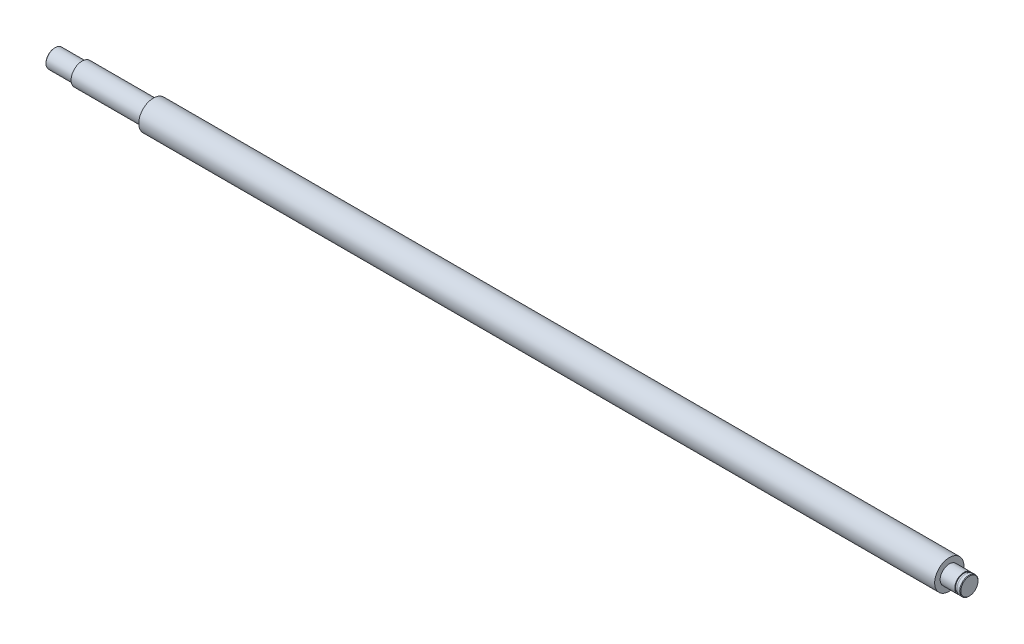
ISO-10303-21;
HEADER;
FILE_DESCRIPTION(('STEP AP214'),'2;1');
FILE_NAME('part.step','',(''),(''),'','','');
FILE_SCHEMA(('AUTOMOTIVE_DESIGN { 1 0 10303 214 1 1 1 1 }'));
ENDSEC;
DATA;
#1=APPLICATION_CONTEXT('core data for automotive mechanical design processes');
#2=APPLICATION_PROTOCOL_DEFINITION('international standard','automotive_design',2000,#1);
#3=PRODUCT_CONTEXT('',#1,'mechanical');
#4=PRODUCT('Part','Part','',(#3));
#5=PRODUCT_RELATED_PRODUCT_CATEGORY('part','',(#4));
#6=PRODUCT_DEFINITION_FORMATION('','',#4);
#7=PRODUCT_DEFINITION_CONTEXT('part definition',#1,'design');
#8=PRODUCT_DEFINITION('design','',#6,#7);
#9=PRODUCT_DEFINITION_SHAPE('','',#8);
#10=(LENGTH_UNIT() NAMED_UNIT(*) SI_UNIT(.MILLI.,.METRE.));
#11=(NAMED_UNIT(*) PLANE_ANGLE_UNIT() SI_UNIT($,.RADIAN.));
#12=(NAMED_UNIT(*) SI_UNIT($,.STERADIAN.) SOLID_ANGLE_UNIT());
#13=UNCERTAINTY_MEASURE_WITH_UNIT(LENGTH_MEASURE(1.E-05),#10,'distance_accuracy_value','');
#14=(GEOMETRIC_REPRESENTATION_CONTEXT(3) GLOBAL_UNCERTAINTY_ASSIGNED_CONTEXT((#13)) GLOBAL_UNIT_ASSIGNED_CONTEXT((#10,
#11,#12)) REPRESENTATION_CONTEXT('',''));
#15=CARTESIAN_POINT('',(0.,0.,0.));
#16=DIRECTION('',(0.,0.,1.));
#17=DIRECTION('',(1.,0.,0.));
#18=AXIS2_PLACEMENT_3D('',#15,#16,#17);
#19=CARTESIAN_POINT('',(-250.,0.,0.));
#20=DIRECTION('',(-1.,0.,0.));
#21=DIRECTION('',(0.,0.,1.));
#22=AXIS2_PLACEMENT_3D('',#19,#20,#21);
#23=CYLINDRICAL_SURFACE('',#22,5.);
#24=CARTESIAN_POINT('',(239.,0.,0.));
#25=DIRECTION('',(-1.,0.,0.));
#26=DIRECTION('',(0.,0.,1.));
#27=AXIS2_PLACEMENT_3D('',#24,#25,#26);
#28=CIRCLE('',#27,5.);
#29=CARTESIAN_POINT('',(239.,0.,5.));
#30=VERTEX_POINT('',#29);
#31=EDGE_CURVE('E70',#30,#30,#28,.T.);
#32=ORIENTED_EDGE('',*,*,#31,.F.);
#33=EDGE_LOOP('',(#32));
#34=FACE_BOUND('',#33,.T.);
#35=CARTESIAN_POINT('',(247.,0.,0.));
#36=DIRECTION('',(-1.,0.,0.));
#37=DIRECTION('',(0.,0.,1.));
#38=AXIS2_PLACEMENT_3D('',#35,#36,#37);
#39=CIRCLE('',#38,5.);
#40=CARTESIAN_POINT('',(247.,0.,5.));
#41=VERTEX_POINT('',#40);
#42=EDGE_CURVE('E82',#41,#41,#39,.T.);
#43=ORIENTED_EDGE('',*,*,#42,.T.);
#44=EDGE_LOOP('',(#43));
#45=FACE_BOUND('',#44,.T.);
#46=ADVANCED_FACE('F35',(#34,#45),#23,.T.);
#47=CARTESIAN_POINT('',(-250.,0.,0.));
#48=DIRECTION('',(1.,0.,0.));
#49=DIRECTION('',(0.,0.,-1.));
#50=AXIS2_PLACEMENT_3D('',#47,#48,#49);
#51=PLANE('',#50);
#52=CARTESIAN_POINT('',(-250.,0.,0.));
#53=DIRECTION('',(1.,0.,0.));
#54=DIRECTION('',(0.,0.,-1.));
#55=AXIS2_PLACEMENT_3D('',#52,#53,#54);
#56=CIRCLE('',#55,4.69999999999998);
#57=CARTESIAN_POINT('',(-250.,0.,-4.69999999999998));
#58=VERTEX_POINT('',#57);
#59=EDGE_CURVE('E50',#58,#58,#56,.F.);
#60=ORIENTED_EDGE('',*,*,#59,.T.);
#61=EDGE_LOOP('',(#60));
#62=FACE_BOUND('',#61,.T.);
#63=ADVANCED_FACE('F105',(#62),#51,.F.);
#64=CARTESIAN_POINT('',(-250.,0.,0.));
#65=DIRECTION('',(-1.,0.,0.));
#66=DIRECTION('',(0.,0.,1.));
#67=AXIS2_PLACEMENT_3D('',#64,#65,#66);
#68=CYLINDRICAL_SURFACE('',#67,5.);
#69=CARTESIAN_POINT('',(-249.7,0.,0.));
#70=DIRECTION('',(1.,0.,0.));
#71=DIRECTION('',(0.,0.,-1.));
#72=AXIS2_PLACEMENT_3D('',#69,#70,#71);
#73=CIRCLE('',#72,5.);
#74=CARTESIAN_POINT('',(-249.7,0.,-5.));
#75=VERTEX_POINT('',#74);
#76=EDGE_CURVE('E46',#75,#75,#73,.T.);
#77=ORIENTED_EDGE('',*,*,#76,.T.);
#78=EDGE_LOOP('',(#77));
#79=FACE_BOUND('',#78,.T.);
#80=CARTESIAN_POINT('',(-235.,0.,0.));
#81=DIRECTION('',(-1.,0.,0.));
#82=DIRECTION('',(0.,0.,1.));
#83=AXIS2_PLACEMENT_3D('',#80,#81,#82);
#84=CIRCLE('',#83,5.);
#85=CARTESIAN_POINT('',(-235.,0.,5.));
#86=VERTEX_POINT('',#85);
#87=EDGE_CURVE('E55',#86,#86,#84,.T.);
#88=ORIENTED_EDGE('',*,*,#87,.T.);
#89=EDGE_LOOP('',(#88));
#90=FACE_BOUND('',#89,.T.);
#91=ADVANCED_FACE('F112',(#79,#90),#68,.T.);
#92=CARTESIAN_POINT('',(-235.,5.,0.));
#93=DIRECTION('',(1.,0.,0.));
#94=DIRECTION('',(0.,0.,-1.));
#95=AXIS2_PLACEMENT_3D('',#92,#93,#94);
#96=PLANE('',#95);
#97=ORIENTED_EDGE('',*,*,#87,.F.);
#98=EDGE_LOOP('',(#97));
#99=FACE_BOUND('',#98,.T.);
#100=CARTESIAN_POINT('',(-235.,0.,0.));
#101=DIRECTION('',(-1.,0.,0.));
#102=DIRECTION('',(0.,0.,1.));
#103=AXIS2_PLACEMENT_3D('',#100,#101,#102);
#104=CIRCLE('',#103,6.);
#105=CARTESIAN_POINT('',(-235.,0.,6.));
#106=VERTEX_POINT('',#105);
#107=EDGE_CURVE('E58',#106,#106,#104,.T.);
#108=ORIENTED_EDGE('',*,*,#107,.T.);
#109=EDGE_LOOP('',(#108));
#110=FACE_BOUND('',#109,.T.);
#111=ADVANCED_FACE('F216',(#99,#110),#96,.F.);
#112=CARTESIAN_POINT('',(-250.,0.,0.));
#113=DIRECTION('',(-1.,0.,0.));
#114=DIRECTION('',(0.,0.,1.));
#115=AXIS2_PLACEMENT_3D('',#112,#113,#114);
#116=CYLINDRICAL_SURFACE('',#115,6.);
#117=ORIENTED_EDGE('',*,*,#107,.F.);
#118=EDGE_LOOP('',(#117));
#119=FACE_BOUND('',#118,.T.);
#120=CARTESIAN_POINT('',(-196.,0.,0.));
#121=DIRECTION('',(-1.,0.,0.));
#122=DIRECTION('',(0.,0.,1.));
#123=AXIS2_PLACEMENT_3D('',#120,#121,#122);
#124=CIRCLE('',#123,6.);
#125=CARTESIAN_POINT('',(-196.,0.,6.));
#126=VERTEX_POINT('',#125);
#127=EDGE_CURVE('E61',#126,#126,#124,.T.);
#128=ORIENTED_EDGE('',*,*,#127,.T.);
#129=EDGE_LOOP('',(#128));
#130=FACE_BOUND('',#129,.T.);
#131=ADVANCED_FACE('F206',(#119,#130),#116,.T.);
#132=CARTESIAN_POINT('',(-196.,6.,0.));
#133=DIRECTION('',(1.,0.,0.));
#134=DIRECTION('',(0.,0.,-1.));
#135=AXIS2_PLACEMENT_3D('',#132,#133,#134);
#136=PLANE('',#135);
#137=ORIENTED_EDGE('',*,*,#127,.F.);
#138=EDGE_LOOP('',(#137));
#139=FACE_BOUND('',#138,.T.);
#140=CARTESIAN_POINT('',(-196.,0.,0.));
#141=DIRECTION('',(-1.,0.,0.));
#142=DIRECTION('',(0.,0.,1.));
#143=AXIS2_PLACEMENT_3D('',#140,#141,#142);
#144=CIRCLE('',#143,8.);
#145=CARTESIAN_POINT('',(-196.,0.,8.));
#146=VERTEX_POINT('',#145);
#147=EDGE_CURVE('E64',#146,#146,#144,.T.);
#148=ORIENTED_EDGE('',*,*,#147,.T.);
#149=EDGE_LOOP('',(#148));
#150=FACE_BOUND('',#149,.T.);
#151=ADVANCED_FACE('F195',(#139,#150),#136,.F.);
#152=CARTESIAN_POINT('',(-250.,0.,0.));
#153=DIRECTION('',(-1.,0.,0.));
#154=DIRECTION('',(0.,0.,1.));
#155=AXIS2_PLACEMENT_3D('',#152,#153,#154);
#156=CYLINDRICAL_SURFACE('',#155,8.);
#157=ORIENTED_EDGE('',*,*,#147,.F.);
#158=EDGE_LOOP('',(#157));
#159=FACE_BOUND('',#158,.T.);
#160=CARTESIAN_POINT('',(239.,0.,0.));
#161=DIRECTION('',(-1.,0.,0.));
#162=DIRECTION('',(0.,0.,1.));
#163=AXIS2_PLACEMENT_3D('',#160,#161,#162);
#164=CIRCLE('',#163,8.);
#165=CARTESIAN_POINT('',(239.,0.,8.));
#166=VERTEX_POINT('',#165);
#167=EDGE_CURVE('E67',#166,#166,#164,.T.);
#168=ORIENTED_EDGE('',*,*,#167,.T.);
#169=EDGE_LOOP('',(#168));
#170=FACE_BOUND('',#169,.T.);
#171=ADVANCED_FACE('F100',(#159,#170),#156,.T.);
#172=CARTESIAN_POINT('',(239.,8.,0.));
#173=DIRECTION('',(-1.,0.,0.));
#174=DIRECTION('',(0.,0.,1.));
#175=AXIS2_PLACEMENT_3D('',#172,#173,#174);
#176=PLANE('',#175);
#177=ORIENTED_EDGE('',*,*,#167,.F.);
#178=EDGE_LOOP('',(#177));
#179=FACE_BOUND('',#178,.T.);
#180=ORIENTED_EDGE('',*,*,#31,.T.);
#181=EDGE_LOOP('',(#180));
#182=FACE_BOUND('',#181,.T.);
#183=ADVANCED_FACE('F90',(#179,#182),#176,.F.);
#184=CARTESIAN_POINT('',(247.,5.,0.));
#185=DIRECTION('',(1.,0.,0.));
#186=DIRECTION('',(0.,0.,-1.));
#187=AXIS2_PLACEMENT_3D('',#184,#185,#186);
#188=PLANE('',#187);
#189=CARTESIAN_POINT('',(247.,0.,0.));
#190=DIRECTION('',(-1.,0.,0.));
#191=DIRECTION('',(0.,0.,1.));
#192=AXIS2_PLACEMENT_3D('',#189,#190,#191);
#193=CIRCLE('',#192,4.6);
#194=CARTESIAN_POINT('',(247.,0.,4.6));
#195=VERTEX_POINT('',#194);
#196=EDGE_CURVE('E73',#195,#195,#193,.T.);
#197=ORIENTED_EDGE('',*,*,#196,.T.);
#198=EDGE_LOOP('',(#197));
#199=FACE_BOUND('',#198,.T.);
#200=ORIENTED_EDGE('',*,*,#42,.F.);
#201=EDGE_LOOP('',(#200));
#202=FACE_BOUND('',#201,.T.);
#203=ADVANCED_FACE('F87',(#199,#202),#188,.T.);
#204=CARTESIAN_POINT('',(239.,0.,0.));
#205=DIRECTION('',(-1.,0.,0.));
#206=DIRECTION('',(0.,0.,1.));
#207=AXIS2_PLACEMENT_3D('',#204,#205,#206);
#208=CYLINDRICAL_SURFACE('',#207,4.6);
#209=CARTESIAN_POINT('',(248.15,0.,0.));
#210=DIRECTION('',(-1.,0.,0.));
#211=DIRECTION('',(0.,0.,1.));
#212=AXIS2_PLACEMENT_3D('',#209,#210,#211);
#213=CIRCLE('',#212,4.6);
#214=CARTESIAN_POINT('',(248.15,0.,4.6));
#215=VERTEX_POINT('',#214);
#216=EDGE_CURVE('E76',#215,#215,#213,.T.);
#217=ORIENTED_EDGE('',*,*,#216,.T.);
#218=EDGE_LOOP('',(#217));
#219=FACE_BOUND('',#218,.T.);
#220=ORIENTED_EDGE('',*,*,#196,.F.);
#221=EDGE_LOOP('',(#220));
#222=FACE_BOUND('',#221,.T.);
#223=ADVANCED_FACE('F89',(#219,#222),#208,.T.);
#224=CARTESIAN_POINT('',(248.15,5.,0.));
#225=DIRECTION('',(-1.,0.,0.));
#226=DIRECTION('',(0.,0.,1.));
#227=AXIS2_PLACEMENT_3D('',#224,#225,#226);
#228=PLANE('',#227);
#229=CARTESIAN_POINT('',(248.15,0.,0.));
#230=DIRECTION('',(-1.,0.,0.));
#231=DIRECTION('',(0.,0.,1.));
#232=AXIS2_PLACEMENT_3D('',#229,#230,#231);
#233=CIRCLE('',#232,5.);
#234=CARTESIAN_POINT('',(248.15,0.,5.));
#235=VERTEX_POINT('',#234);
#236=EDGE_CURVE('E79',#235,#235,#233,.T.);
#237=ORIENTED_EDGE('',*,*,#236,.T.);
#238=EDGE_LOOP('',(#237));
#239=FACE_BOUND('',#238,.T.);
#240=ORIENTED_EDGE('',*,*,#216,.F.);
#241=EDGE_LOOP('',(#240));
#242=FACE_BOUND('',#241,.T.);
#243=ADVANCED_FACE('F97',(#239,#242),#228,.T.);
#244=CARTESIAN_POINT('',(250.,5.,0.));
#245=DIRECTION('',(-1.,0.,0.));
#246=DIRECTION('',(0.,0.,1.));
#247=AXIS2_PLACEMENT_3D('',#244,#245,#246);
#248=PLANE('',#247);
#249=CARTESIAN_POINT('',(250.,0.,0.));
#250=DIRECTION('',(-1.,0.,0.));
#251=DIRECTION('',(0.,0.,1.));
#252=AXIS2_PLACEMENT_3D('',#249,#250,#251);
#253=CIRCLE('',#252,4.70000000000004);
#254=CARTESIAN_POINT('',(250.,0.,4.70000000000004));
#255=VERTEX_POINT('',#254);
#256=EDGE_CURVE('E10',#255,#255,#253,.F.);
#257=ORIENTED_EDGE('',*,*,#256,.T.);
#258=EDGE_LOOP('',(#257));
#259=FACE_BOUND('',#258,.T.);
#260=ADVANCED_FACE('F118',(#259),#248,.F.);
#261=CARTESIAN_POINT('',(249.7,0.,0.));
#262=DIRECTION('',(-1.,0.,0.));
#263=DIRECTION('',(0.,0.,1.));
#264=AXIS2_PLACEMENT_3D('',#261,#262,#263);
#265=CIRCLE('',#264,5.);
#266=CARTESIAN_POINT('',(249.7,0.,5.));
#267=VERTEX_POINT('',#266);
#268=EDGE_CURVE('E42',#267,#267,#265,.T.);
#269=ORIENTED_EDGE('',*,*,#268,.T.);
#270=EDGE_LOOP('',(#269));
#271=FACE_BOUND('',#270,.T.);
#272=ORIENTED_EDGE('',*,*,#236,.F.);
#273=EDGE_LOOP('',(#272));
#274=FACE_BOUND('',#273,.T.);
#275=ADVANCED_FACE('F108',(#271,#274),#23,.T.);
#276=CARTESIAN_POINT('',(-250.,0.,0.));
#277=DIRECTION('',(1.,0.,0.));
#278=DIRECTION('',(0.,0.,-1.));
#279=AXIS2_PLACEMENT_3D('',#276,#277,#278);
#280=CONICAL_SURFACE('',#279,4.69999999999998,0.785398163397534);
#281=ORIENTED_EDGE('',*,*,#76,.F.);
#282=EDGE_LOOP('',(#281));
#283=FACE_BOUND('',#282,.T.);
#284=ORIENTED_EDGE('',*,*,#59,.F.);
#285=EDGE_LOOP('',(#284));
#286=FACE_BOUND('',#285,.T.);
#287=ADVANCED_FACE('F117',(#283,#286),#280,.T.);
#288=CARTESIAN_POINT('',(249.7,0.,0.));
#289=DIRECTION('',(-1.,0.,0.));
#290=DIRECTION('',(0.,0.,1.));
#291=AXIS2_PLACEMENT_3D('',#288,#289,#290);
#292=CONICAL_SURFACE('',#291,5.,0.78539816339744);
#293=ORIENTED_EDGE('',*,*,#256,.F.);
#294=EDGE_LOOP('',(#293));
#295=FACE_BOUND('',#294,.T.);
#296=ORIENTED_EDGE('',*,*,#268,.F.);
#297=EDGE_LOOP('',(#296));
#298=FACE_BOUND('',#297,.T.);
#299=ADVANCED_FACE('F37',(#295,#298),#292,.T.);
#300=CLOSED_SHELL('',(#46,#63,#91,#111,#131,#151,#171,#183,#203,#223,#243,#260,#275,#287,#299));
#301=MANIFOLD_SOLID_BREP('B2',#300);
#302=ADVANCED_BREP_SHAPE_REPRESENTATION('',(#18,#301),#14);
#303=SHAPE_DEFINITION_REPRESENTATION(#9,#302);
ENDSEC;
END-ISO-10303-21;
